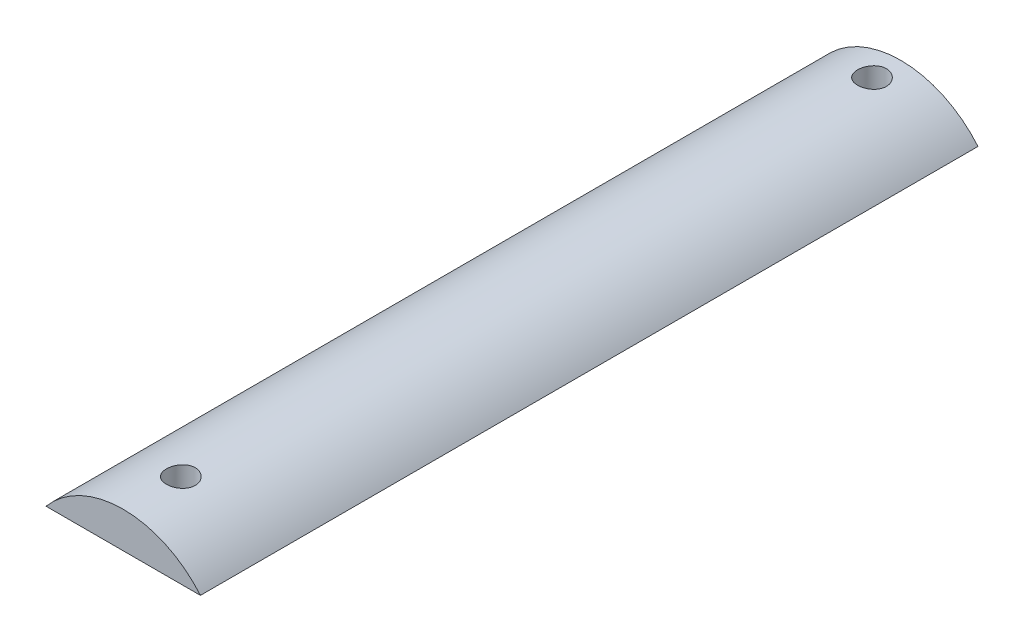
ISO-10303-21;
HEADER;
FILE_DESCRIPTION(('STEP AP214'),'2;1');
FILE_NAME('part.step','',(''),(''),'','','');
FILE_SCHEMA(('AUTOMOTIVE_DESIGN { 1 0 10303 214 1 1 1 1 }'));
ENDSEC;
DATA;
#1=APPLICATION_CONTEXT('core data for automotive mechanical design processes');
#2=APPLICATION_PROTOCOL_DEFINITION('international standard','automotive_design',2000,#1);
#3=PRODUCT_CONTEXT('',#1,'mechanical');
#4=PRODUCT('Part','Part','',(#3));
#5=PRODUCT_RELATED_PRODUCT_CATEGORY('part','',(#4));
#6=PRODUCT_DEFINITION_FORMATION('','',#4);
#7=PRODUCT_DEFINITION_CONTEXT('part definition',#1,'design');
#8=PRODUCT_DEFINITION('design','',#6,#7);
#9=PRODUCT_DEFINITION_SHAPE('','',#8);
#10=(LENGTH_UNIT() NAMED_UNIT(*) SI_UNIT(.MILLI.,.METRE.));
#11=(NAMED_UNIT(*) PLANE_ANGLE_UNIT() SI_UNIT($,.RADIAN.));
#12=(NAMED_UNIT(*) SI_UNIT($,.STERADIAN.) SOLID_ANGLE_UNIT());
#13=UNCERTAINTY_MEASURE_WITH_UNIT(LENGTH_MEASURE(1.E-05),#10,'distance_accuracy_value','');
#14=(GEOMETRIC_REPRESENTATION_CONTEXT(3) GLOBAL_UNCERTAINTY_ASSIGNED_CONTEXT((#13)) GLOBAL_UNIT_ASSIGNED_CONTEXT((#10,
#11,#12)) REPRESENTATION_CONTEXT('',''));
#15=CARTESIAN_POINT('',(0.,0.,0.));
#16=DIRECTION('',(0.,0.,1.));
#17=DIRECTION('',(1.,0.,0.));
#18=AXIS2_PLACEMENT_3D('',#15,#16,#17);
#19=CARTESIAN_POINT('',(0.,4.5,54.));
#20=DIRECTION('',(0.,1.,0.));
#21=DIRECTION('',(0.,0.,1.));
#22=AXIS2_PLACEMENT_3D('',#19,#20,#21);
#23=PLANE('',#22);
#24=DIRECTION('',(-0.5,0.,0.866025403784439));
#25=VECTOR('',#24,1.);
#26=CARTESIAN_POINT('',(2.30940107675834,4.5,50.));
#27=LINE('',#26,#25);
#28=CARTESIAN_POINT('',(2.30940107675834,4.5,50.));
#29=VERTEX_POINT('',#28);
#30=CARTESIAN_POINT('',(1.15470053837908,4.5,52.));
#31=VERTEX_POINT('',#30);
#32=EDGE_CURVE('E220',#29,#31,#27,.T.);
#33=ORIENTED_EDGE('',*,*,#32,.F.);
#34=DIRECTION('',(0.5,0.,0.866025403784439));
#35=VECTOR('',#34,1.);
#36=CARTESIAN_POINT('',(1.15470053837908,4.5,48.));
#37=LINE('',#36,#35);
#38=CARTESIAN_POINT('',(1.15470053837908,4.5,48.));
#39=VERTEX_POINT('',#38);
#40=EDGE_CURVE('E52',#39,#29,#37,.T.);
#41=ORIENTED_EDGE('',*,*,#40,.F.);
#42=DIRECTION('',(1.,0.,0.));
#43=VECTOR('',#42,1.);
#44=CARTESIAN_POINT('',(-1.15470053837942,4.5,48.));
#45=LINE('',#44,#43);
#46=CARTESIAN_POINT('',(-1.15470053837942,4.5,48.));
#47=VERTEX_POINT('',#46);
#48=EDGE_CURVE('E203',#47,#39,#45,.T.);
#49=ORIENTED_EDGE('',*,*,#48,.F.);
#50=DIRECTION('',(0.5,0.,-0.866025403784439));
#51=VECTOR('',#50,1.);
#52=CARTESIAN_POINT('',(-2.30940107675867,4.5,50.));
#53=LINE('',#52,#51);
#54=CARTESIAN_POINT('',(-2.30940107675867,4.5,50.));
#55=VERTEX_POINT('',#54);
#56=EDGE_CURVE('E229',#55,#47,#53,.T.);
#57=ORIENTED_EDGE('',*,*,#56,.F.);
#58=DIRECTION('',(-0.499999999999999,0.,-0.866025403784439));
#59=VECTOR('',#58,1.);
#60=CARTESIAN_POINT('',(-1.15470053837942,4.5,52.));
#61=LINE('',#60,#59);
#62=CARTESIAN_POINT('',(-1.15470053837942,4.5,52.));
#63=VERTEX_POINT('',#62);
#64=EDGE_CURVE('E226',#63,#55,#61,.T.);
#65=ORIENTED_EDGE('',*,*,#64,.F.);
#66=DIRECTION('',(-1.,0.,0.));
#67=VECTOR('',#66,1.);
#68=CARTESIAN_POINT('',(1.15470053837908,4.5,52.));
#69=LINE('',#68,#67);
#70=EDGE_CURVE('E223',#31,#63,#69,.T.);
#71=ORIENTED_EDGE('',*,*,#70,.F.);
#72=EDGE_LOOP('',(#33,#41,#49,#57,#65,#71));
#73=FACE_BOUND('',#72,.T.);
#74=DIRECTION('',(-0.5,0.,0.866025403784439));
#75=VECTOR('',#74,1.);
#76=CARTESIAN_POINT('',(2.3094010767585,4.5,2.));
#77=LINE('',#76,#75);
#78=CARTESIAN_POINT('',(2.3094010767585,4.5,2.));
#79=VERTEX_POINT('',#78);
#80=CARTESIAN_POINT('',(1.15470053837925,4.5,4.));
#81=VERTEX_POINT('',#80);
#82=EDGE_CURVE('E180',#79,#81,#77,.T.);
#83=ORIENTED_EDGE('',*,*,#82,.F.);
#84=DIRECTION('',(0.5,0.,0.866025403784439));
#85=VECTOR('',#84,1.);
#86=CARTESIAN_POINT('',(1.15470053837925,4.5,0.));
#87=LINE('',#86,#85);
#88=CARTESIAN_POINT('',(1.15470053837925,4.5,0.));
#89=VERTEX_POINT('',#88);
#90=EDGE_CURVE('E145',#89,#79,#87,.T.);
#91=ORIENTED_EDGE('',*,*,#90,.F.);
#92=DIRECTION('',(1.,0.,0.));
#93=VECTOR('',#92,1.);
#94=CARTESIAN_POINT('',(0.,4.5,0.));
#95=LINE('',#94,#93);
#96=CARTESIAN_POINT('',(5.36190264738181,4.5,0.));
#97=VERTEX_POINT('',#96);
#98=EDGE_CURVE('E190',#89,#97,#95,.T.);
#99=ORIENTED_EDGE('',*,*,#98,.T.);
#100=DIRECTION('',(0.,0.,-1.));
#101=VECTOR('',#100,1.);
#102=CARTESIAN_POINT('',(5.36190264738181,4.5,54.));
#103=LINE('',#102,#101);
#104=CARTESIAN_POINT('',(5.36190264738181,4.5,54.));
#105=VERTEX_POINT('',#104);
#106=EDGE_CURVE('E45',#105,#97,#103,.T.);
#107=ORIENTED_EDGE('',*,*,#106,.F.);
#108=DIRECTION('',(1.,0.,0.));
#109=VECTOR('',#108,1.);
#110=CARTESIAN_POINT('',(0.,4.5,54.));
#111=LINE('',#110,#109);
#112=CARTESIAN_POINT('',(-5.36190264738181,4.5,54.));
#113=VERTEX_POINT('',#112);
#114=EDGE_CURVE('E244',#113,#105,#111,.T.);
#115=ORIENTED_EDGE('',*,*,#114,.F.);
#116=DIRECTION('',(0.,0.,-1.));
#117=VECTOR('',#116,1.);
#118=CARTESIAN_POINT('',(-5.36190264738181,4.5,54.));
#119=LINE('',#118,#117);
#120=CARTESIAN_POINT('',(-5.36190264738181,4.5,0.));
#121=VERTEX_POINT('',#120);
#122=EDGE_CURVE('E250',#113,#121,#119,.T.);
#123=ORIENTED_EDGE('',*,*,#122,.T.);
#124=CARTESIAN_POINT('',(-1.15470053837925,4.5,0.));
#125=VERTEX_POINT('',#124);
#126=EDGE_CURVE('E251',#121,#125,#95,.T.);
#127=ORIENTED_EDGE('',*,*,#126,.T.);
#128=DIRECTION('',(0.5,0.,-0.866025403784439));
#129=VECTOR('',#128,1.);
#130=CARTESIAN_POINT('',(-2.3094010767585,4.5,2.));
#131=LINE('',#130,#129);
#132=CARTESIAN_POINT('',(-2.3094010767585,4.5,2.));
#133=VERTEX_POINT('',#132);
#134=EDGE_CURVE('E162',#133,#125,#131,.T.);
#135=ORIENTED_EDGE('',*,*,#134,.F.);
#136=DIRECTION('',(-0.5,0.,-0.866025403784439));
#137=VECTOR('',#136,1.);
#138=CARTESIAN_POINT('',(-1.15470053837925,4.5,4.));
#139=LINE('',#138,#137);
#140=CARTESIAN_POINT('',(-1.15470053837925,4.5,4.));
#141=VERTEX_POINT('',#140);
#142=EDGE_CURVE('E164',#141,#133,#139,.T.);
#143=ORIENTED_EDGE('',*,*,#142,.F.);
#144=DIRECTION('',(-1.,0.,0.));
#145=VECTOR('',#144,1.);
#146=CARTESIAN_POINT('',(1.15470053837925,4.5,4.));
#147=LINE('',#146,#145);
#148=EDGE_CURVE('E183',#81,#141,#147,.T.);
#149=ORIENTED_EDGE('',*,*,#148,.F.);
#150=EDGE_LOOP('',(#83,#91,#99,#107,#115,#123,#127,#135,#143,#149));
#151=FACE_BOUND('',#150,.T.);
#152=ADVANCED_FACE('F34',(#73,#151),#23,.F.);
#153=CARTESIAN_POINT('',(0.,0.,54.));
#154=DIRECTION('',(0.,0.,-1.));
#155=DIRECTION('',(-1.,0.,0.));
#156=AXIS2_PLACEMENT_3D('',#153,#154,#155);
#157=CYLINDRICAL_SURFACE('',#156,7.);
#158=CARTESIAN_POINT('',(0.,7.,1.));
#159=CARTESIAN_POINT('',(0.0558653647064106,6.99999913522882,1.00000232658881));
#160=CARTESIAN_POINT('',(0.111763905495517,6.99932420200296,1.0046972071594));
#161=CARTESIAN_POINT('',(0.222000660368081,6.99669670505877,1.02334913623399));
#162=CARTESIAN_POINT('',(0.276337265533478,6.99474286996306,1.03731540177038));
#163=CARTESIAN_POINT('',(0.381838676785442,6.98977730161823,1.07408606173423));
#164=CARTESIAN_POINT('',(0.43300576934977,6.98676634168295,1.09688399682651));
#165=CARTESIAN_POINT('',(0.530779650240317,6.98001989080586,1.15065554289536));
#166=CARTESIAN_POINT('',(0.57738711543865,6.97628450765023,1.18162793784958));
#167=CARTESIAN_POINT('',(0.665058650397312,6.96847539120891,1.25110417116727));
#168=CARTESIAN_POINT('',(0.70608559080065,6.96439965767478,1.28965464285791));
#169=CARTESIAN_POINT('',(0.781111291768627,6.95638499821218,1.37309241453966));
#170=CARTESIAN_POINT('',(0.815109662708696,6.95244607987804,1.41798006559652));
#171=CARTESIAN_POINT('',(0.875255876422228,6.94513156490684,1.51306511605375));
#172=CARTESIAN_POINT('',(0.901368125473884,6.94175855199628,1.56328524628515));
#173=CARTESIAN_POINT('',(0.944773451668098,6.93598482656287,1.66745453949105));
#174=CARTESIAN_POINT('',(0.962066964544983,6.93358406600217,1.72140351807332));
#175=CARTESIAN_POINT('',(0.987229320061167,6.93004619376593,1.83111000982802));
#176=CARTESIAN_POINT('',(0.995161488527954,6.92890059523603,1.88685271992782));
#177=CARTESIAN_POINT('',(1.00157210007568,6.92797693845422,1.9988889054348));
#178=CARTESIAN_POINT('',(1.00005103626979,6.92819880887042,2.05518235196072));
#179=CARTESIAN_POINT('',(0.987650180979409,6.9299772577103,2.16627654533307));
#180=CARTESIAN_POINT('',(0.976840681796494,6.9315238110212,2.22108532204585));
#181=CARTESIAN_POINT('',(0.946279723214286,6.93576171689508,2.32810308628426));
#182=CARTESIAN_POINT('',(0.926528032474813,6.9384530990754,2.38031200651116));
#183=CARTESIAN_POINT('',(0.878569521249536,6.94468857735278,2.48086327310843));
#184=CARTESIAN_POINT('',(0.85033269311634,6.94823569081255,2.5291911123858));
#185=CARTESIAN_POINT('',(0.786226845720379,6.95578073890064,2.6204492121893));
#186=CARTESIAN_POINT('',(0.750357371512553,6.95977870039515,2.66337915072994));
#187=CARTESIAN_POINT('',(0.671617458714389,6.9678193568045,2.74303040311463));
#188=CARTESIAN_POINT('',(0.628686537577609,6.97186212884533,2.77969194505996));
#189=CARTESIAN_POINT('',(0.537249159400889,6.97950317895594,2.84529850122326));
#190=CARTESIAN_POINT('',(0.48874268187249,6.98310145539225,2.87424348708397));
#191=CARTESIAN_POINT('',(0.387481039813844,6.98945135313469,2.92359743749929));
#192=CARTESIAN_POINT('',(0.334723727733655,6.99220254306019,2.94400205474713));
#193=CARTESIAN_POINT('',(0.226483349377097,6.99654459946019,2.97564546931975));
#194=CARTESIAN_POINT('',(0.171000450315641,6.99813553702157,2.98688482819091));
#195=CARTESIAN_POINT('',(0.0594000111949727,6.99996847286368,2.99979981341021));
#196=CARTESIAN_POINT('',(0.00329216977119557,7.00022206812239,3.00155766323425));
#197=CARTESIAN_POINT('',(-0.108417425156648,6.9993832363385,2.99567759598996));
#198=CARTESIAN_POINT('',(-0.164019192788029,6.99829084698658,2.98803994201746));
#199=CARTESIAN_POINT('',(-0.272891208992243,6.99488996866151,2.96365402920264));
#200=CARTESIAN_POINT('',(-0.326170552460061,6.99258679365044,2.94694557041022));
#201=CARTESIAN_POINT('',(-0.429171472012341,6.98702187136217,2.90493413035229));
#202=CARTESIAN_POINT('',(-0.47889289454054,6.98376008274315,2.87963077841043));
#203=CARTESIAN_POINT('',(-0.573729847898929,6.97661188585467,2.82095309150627));
#204=CARTESIAN_POINT('',(-0.618812606348985,6.97272147424604,2.78752628514727));
#205=CARTESIAN_POINT('',(-0.70275764740243,6.96476223215387,2.71362396197387));
#206=CARTESIAN_POINT('',(-0.741619603539291,6.96069339232073,2.67314807545766));
#207=CARTESIAN_POINT('',(-0.812316823103834,6.95279940084852,2.58593164951777));
#208=CARTESIAN_POINT('',(-0.844097150424188,6.94897630774254,2.53914636484974));
#209=CARTESIAN_POINT('',(-0.899347843769572,6.94204235740405,2.440853406698));
#210=CARTESIAN_POINT('',(-0.922818417525415,6.9389314823679,2.38934585130419));
#211=CARTESIAN_POINT('',(-0.960697053792666,6.93378885130881,2.28323834774685));
#212=CARTESIAN_POINT('',(-0.975134650659851,6.93175358189617,2.22864912057935));
#213=CARTESIAN_POINT('',(-0.994631866000765,6.92898304632217,2.1177897194722));
#214=CARTESIAN_POINT('',(-0.999692066965096,6.92824769941436,2.06151965016116));
#215=CARTESIAN_POINT('',(-1.00027795187105,6.92816308872538,1.94944308673935));
#216=CARTESIAN_POINT('',(-0.99588998683903,6.92880127161589,1.89363703417234));
#217=CARTESIAN_POINT('',(-0.977888479253999,6.9313646210599,1.78356493797077));
#218=CARTESIAN_POINT('',(-0.964274946206753,6.93328978628734,1.72929889274949));
#219=CARTESIAN_POINT('',(-0.92823822782898,6.93820594738757,1.62386736744441));
#220=CARTESIAN_POINT('',(-0.905820514813006,6.94119628108845,1.57269998411848));
#221=CARTESIAN_POINT('',(-0.852820321015437,6.94790672863692,1.4748387775233));
#222=CARTESIAN_POINT('',(-0.822237615959197,6.95162686252979,1.4281450771843));
#223=CARTESIAN_POINT('',(-0.753459737315476,6.95941831326445,1.34011709073554));
#224=CARTESIAN_POINT('',(-0.715200464701825,6.96349241131826,1.29883312739888));
#225=CARTESIAN_POINT('',(-0.632290756660576,6.97150911027032,1.22324014628388));
#226=CARTESIAN_POINT('',(-0.587638832167471,6.97545168026666,1.18893275810575));
#227=CARTESIAN_POINT('',(-0.492951712266923,6.98278331246282,1.12811621398193));
#228=CARTESIAN_POINT('',(-0.442890858727148,6.98616952559765,1.10164667292105));
#229=CARTESIAN_POINT('',(-0.339010644185018,6.99197878037442,1.05753012799695));
#230=CARTESIAN_POINT('',(-0.28519530259949,6.99440283401541,1.03987384928381));
#231=CARTESIAN_POINT('',(-0.192605681998779,6.99745181502523,1.01795820654369));
#232=CARTESIAN_POINT('',(-0.154406949589287,6.99840255428231,1.01123398153088));
#233=CARTESIAN_POINT('',(-0.0774774606828314,6.99967694328895,1.0022540954559));
#234=CARTESIAN_POINT('',(-0.0387467099115308,7.00000059978196,0.999998386340764));
#235=CARTESIAN_POINT('',(0.,7.,1.));
#236=B_SPLINE_CURVE_WITH_KNOTS('',3,(#158,#159,#160,#161,#162,#163,#164,#165,#166,#167,#168,
#169,#170,#171,#172,#173,#174,#175,#176,#177,#178,#179,#180,#181,#182,#183,#184,#185,#186,#187,
#188,#189,#190,#191,#192,#193,#194,#195,#196,#197,#198,#199,#200,#201,#202,#203,#204,#205,#206,
#207,#208,#209,#210,#211,#212,#213,#214,#215,#216,#217,#218,#219,#220,#221,#222,#223,#224,#225,
#226,#227,#228,#229,#230,#231,#232,#233,#234,#235),.UNSPECIFIED.,.T.,.F.,(4,2,2,2,2,2,2,2,2,2,2,
2,2,2,2,2,2,2,2,2,2,2,2,2,2,2,2,2,2,2,2,2,2,2,2,2,2,2,4),(0.,0.167454526676438,
0.335075775995835,0.502574660696851,0.67004864250517,0.838587434288067,1.00713556641494,
1.17643344042558,1.34572294860658,1.51386059320977,1.68198946724779,1.84885708289861,
2.01572901576745,2.18319817810949,2.35067732527464,2.51967378353348,2.6886708628223,
2.85775386243831,3.02682650172624,3.19443056043042,3.3620299259403,3.5288997886847,
3.69577684902495,3.86376187993315,4.03175572377582,4.20101062362346,4.37026129206513,
4.53895564370425,4.70763951629676,4.87478825923561,5.0419368299494,5.20898167202542,
5.37603110293353,5.54453823754737,5.71308468724557,5.88246902499656,6.05167472923067,
6.1678179205788,6.28395986295406),.UNSPECIFIED.);
#237=CARTESIAN_POINT('',(0.,7.,1.));
#238=VERTEX_POINT('',#237);
#239=EDGE_CURVE('E167',#238,#238,#236,.T.);
#240=ORIENTED_EDGE('',*,*,#239,.T.);
#241=EDGE_LOOP('',(#240));
#242=FACE_BOUND('',#241,.T.);
#243=CARTESIAN_POINT('',(-1.6759110426447E-13,7.,49.));
#244=CARTESIAN_POINT('',(0.0558653647062429,6.99999913522882,49.0000023265888));
#245=CARTESIAN_POINT('',(0.111763905495349,6.99932420200296,49.0046972071594));
#246=CARTESIAN_POINT('',(0.222000660367912,6.99669670505878,49.023349136234));
#247=CARTESIAN_POINT('',(0.276337265533309,6.99474286996307,49.0373154017704));
#248=CARTESIAN_POINT('',(0.381838676785273,6.98977730161824,49.0740860617342));
#249=CARTESIAN_POINT('',(0.433005769349602,6.98676634168296,49.0968839968265));
#250=CARTESIAN_POINT('',(0.53077965024015,6.98001989080588,49.1506555428954));
#251=CARTESIAN_POINT('',(0.577387115438482,6.97628450765025,49.1816279378496));
#252=CARTESIAN_POINT('',(0.665058650397143,6.96847539120893,49.2511041711673));
#253=CARTESIAN_POINT('',(0.70608559080048,6.96439965767479,49.2896546428579));
#254=CARTESIAN_POINT('',(0.781111291768457,6.95638499821219,49.3730924145397));
#255=CARTESIAN_POINT('',(0.815109662708528,6.95244607987806,49.4179800655965));
#256=CARTESIAN_POINT('',(0.875255876422061,6.94513156490686,49.5130651160538));
#257=CARTESIAN_POINT('',(0.901368125473716,6.94175855199631,49.5632852462852));
#258=CARTESIAN_POINT('',(0.944773451667931,6.93598482656289,49.6674545394911));
#259=CARTESIAN_POINT('',(0.962066964544816,6.93358406600219,49.7214035180733));
#260=CARTESIAN_POINT('',(0.987229320061001,6.93004619376596,49.831110009828));
#261=CARTESIAN_POINT('',(0.995161488527787,6.92890059523605,49.8868527199278));
#262=CARTESIAN_POINT('',(1.00157210007552,6.92797693845424,49.9988889054348));
#263=CARTESIAN_POINT('',(1.00005103626962,6.92819880887044,50.0551823519607));
#264=CARTESIAN_POINT('',(0.987650180979242,6.92997725771032,50.1662765453331));
#265=CARTESIAN_POINT('',(0.976840681796326,6.93152381102122,50.2210853220459));
#266=CARTESIAN_POINT('',(0.946279723214119,6.9357617168951,50.3281030862843));
#267=CARTESIAN_POINT('',(0.926528032474647,6.93845309907542,50.3803120065112));
#268=CARTESIAN_POINT('',(0.87856952124937,6.94468857735281,50.4808632731084));
#269=CARTESIAN_POINT('',(0.850332693116172,6.94823569081257,50.5291911123858));
#270=CARTESIAN_POINT('',(0.786226845720212,6.95578073890066,50.6204492121893));
#271=CARTESIAN_POINT('',(0.750357371512386,6.95977870039517,50.6633791507299));
#272=CARTESIAN_POINT('',(0.671617458714221,6.96781935680452,50.7430304031146));
#273=CARTESIAN_POINT('',(0.62868653757744,6.97186212884534,50.77969194506));
#274=CARTESIAN_POINT('',(0.537249159400719,6.97950317895596,50.8452985012233));
#275=CARTESIAN_POINT('',(0.48874268187232,6.98310145539226,50.874243487084));
#276=CARTESIAN_POINT('',(0.387481039813676,6.9894513531347,50.9235974374993));
#277=CARTESIAN_POINT('',(0.334723727733488,6.9922025430602,50.9440020547471));
#278=CARTESIAN_POINT('',(0.226483349376931,6.99654459946019,50.9756454693198));
#279=CARTESIAN_POINT('',(0.171000450315474,6.99813553702158,50.9868848281909));
#280=CARTESIAN_POINT('',(0.0594000111948055,6.99996847286368,50.9997998134102));
#281=CARTESIAN_POINT('',(0.00329216977102907,7.00022206812239,51.0015576632343));
#282=CARTESIAN_POINT('',(-0.108417425156814,6.9993832363385,50.99567759599));
#283=CARTESIAN_POINT('',(-0.164019192788196,6.99829084698658,50.9880399420175));
#284=CARTESIAN_POINT('',(-0.27289120899241,6.9948899686615,50.9636540292027));
#285=CARTESIAN_POINT('',(-0.326170552460228,6.99258679365044,50.9469455704102));
#286=CARTESIAN_POINT('',(-0.429171472012507,6.98702187136216,50.9049341303523));
#287=CARTESIAN_POINT('',(-0.478892894540707,6.98376008274314,50.8796307784104));
#288=CARTESIAN_POINT('',(-0.573729847899095,6.97661188585466,50.8209530915063));
#289=CARTESIAN_POINT('',(-0.61881260634915,6.97272147424602,50.7875262851473));
#290=CARTESIAN_POINT('',(-0.702757647402596,6.96476223215386,50.7136239619739));
#291=CARTESIAN_POINT('',(-0.741619603539457,6.96069339232071,50.6731480754577));
#292=CARTESIAN_POINT('',(-0.812316823104001,6.9527994008485,50.5859316495178));
#293=CARTESIAN_POINT('',(-0.844097150424355,6.94897630774252,50.5391463648497));
#294=CARTESIAN_POINT('',(-0.89934784376974,6.94204235740403,50.440853406698));
#295=CARTESIAN_POINT('',(-0.922818417525583,6.93893148236787,50.3893458513042));
#296=CARTESIAN_POINT('',(-0.960697053792834,6.93378885130878,50.2832383477469));
#297=CARTESIAN_POINT('',(-0.975134650660019,6.93175358189615,50.2286491205794));
#298=CARTESIAN_POINT('',(-0.994631866000932,6.92898304632215,50.1177897194722));
#299=CARTESIAN_POINT('',(-0.999692066965264,6.92824769941433,50.0615196501612));
#300=CARTESIAN_POINT('',(-1.00027795187122,6.92816308872536,49.9494430867394));
#301=CARTESIAN_POINT('',(-0.995889986839198,6.92880127161586,49.8936370341723));
#302=CARTESIAN_POINT('',(-0.977888479254165,6.93136462105988,49.7835649379708));
#303=CARTESIAN_POINT('',(-0.96427494620692,6.93328978628732,49.7292988927495));
#304=CARTESIAN_POINT('',(-0.928238227829149,6.93820594738754,49.6238673674444));
#305=CARTESIAN_POINT('',(-0.905820514813177,6.94119628108843,49.5726999841185));
#306=CARTESIAN_POINT('',(-0.852820321015609,6.9479067286369,49.4748387775233));
#307=CARTESIAN_POINT('',(-0.822237615959368,6.95162686252977,49.4281450771843));
#308=CARTESIAN_POINT('',(-0.753459737315644,6.95941831326443,49.3401170907355));
#309=CARTESIAN_POINT('',(-0.715200464701993,6.96349241131824,49.2988331273989));
#310=CARTESIAN_POINT('',(-0.632290756660744,6.97150911027031,49.2232401462839));
#311=CARTESIAN_POINT('',(-0.58763883216764,6.97545168026665,49.1889327581058));
#312=CARTESIAN_POINT('',(-0.492951712267093,6.9827833124628,49.1281162139819));
#313=CARTESIAN_POINT('',(-0.442890858727319,6.98616952559764,49.1016466729211));
#314=CARTESIAN_POINT('',(-0.339010644185189,6.99197878037441,49.057530127997));
#315=CARTESIAN_POINT('',(-0.28519530259966,6.9944028340154,49.0398738492838));
#316=CARTESIAN_POINT('',(-0.192605681998948,6.99745181502523,49.0179582065437));
#317=CARTESIAN_POINT('',(-0.154406949589455,6.99840255428231,49.0112339815309));
#318=CARTESIAN_POINT('',(-0.0774774606829997,6.99967694328895,49.0022540954559));
#319=CARTESIAN_POINT('',(-0.0387467099116987,7.00000059978196,48.9999983863408));
#320=CARTESIAN_POINT('',(-1.6759110426447E-13,7.,49.));
#321=B_SPLINE_CURVE_WITH_KNOTS('',3,(#243,#244,#245,#246,#247,#248,#249,#250,#251,#252,#253,
#254,#255,#256,#257,#258,#259,#260,#261,#262,#263,#264,#265,#266,#267,#268,#269,#270,#271,#272,
#273,#274,#275,#276,#277,#278,#279,#280,#281,#282,#283,#284,#285,#286,#287,#288,#289,#290,#291,
#292,#293,#294,#295,#296,#297,#298,#299,#300,#301,#302,#303,#304,#305,#306,#307,#308,#309,#310,
#311,#312,#313,#314,#315,#316,#317,#318,#319,#320),.UNSPECIFIED.,.T.,.F.,(4,2,2,2,2,2,2,2,2,2,2,
2,2,2,2,2,2,2,2,2,2,2,2,2,2,2,2,2,2,2,2,2,2,2,2,2,2,2,4),(0.,0.167454526676438,
0.335075775995835,0.502574660696851,0.670048642505167,0.838587434288064,1.00713556641494,
1.17643344042558,1.34572294860658,1.51386059320977,1.68198946724779,1.84885708289861,
2.01572901576745,2.18319817810949,2.35067732527464,2.51967378353348,2.6886708628223,
2.8577538624383,3.02682650172624,3.19443056043042,3.36202992594029,3.5288997886847,
3.69577684902495,3.86376187993314,4.03175572377582,4.20101062362345,4.37026129206513,
4.53895564370424,4.70763951629676,4.87478825923561,5.0419368299494,5.20898167202541,
5.37603110293353,5.54453823754737,5.71308468724556,5.88246902499656,6.05167472923067,
6.1678179205788,6.28395986295406),.UNSPECIFIED.);
#322=CARTESIAN_POINT('',(-1.6759110426447E-13,7.,49.));
#323=VERTEX_POINT('',#322);
#324=EDGE_CURVE('E11',#323,#323,#321,.T.);
#325=ORIENTED_EDGE('',*,*,#324,.T.);
#326=EDGE_LOOP('',(#325));
#327=FACE_BOUND('',#326,.T.);
#328=CARTESIAN_POINT('',(0.,0.,0.));
#329=DIRECTION('',(0.,0.,1.));
#330=DIRECTION('',(1.,0.,0.));
#331=AXIS2_PLACEMENT_3D('',#328,#329,#330);
#332=CIRCLE('',#331,7.);
#333=EDGE_CURVE('E248',#97,#121,#332,.T.);
#334=ORIENTED_EDGE('',*,*,#333,.T.);
#335=ORIENTED_EDGE('',*,*,#122,.F.);
#336=CARTESIAN_POINT('',(0.,0.,54.));
#337=DIRECTION('',(0.,0.,1.));
#338=DIRECTION('',(1.,0.,0.));
#339=AXIS2_PLACEMENT_3D('',#336,#337,#338);
#340=CIRCLE('',#339,7.);
#341=EDGE_CURVE('E247',#105,#113,#340,.T.);
#342=ORIENTED_EDGE('',*,*,#341,.F.);
#343=ORIENTED_EDGE('',*,*,#106,.T.);
#344=EDGE_LOOP('',(#334,#335,#342,#343));
#345=FACE_BOUND('',#344,.T.);
#346=ADVANCED_FACE('F259',(#242,#327,#345),#157,.T.);
#347=CARTESIAN_POINT('',(0.,0.,54.));
#348=DIRECTION('',(0.,0.,1.));
#349=DIRECTION('',(1.,0.,0.));
#350=AXIS2_PLACEMENT_3D('',#347,#348,#349);
#351=PLANE('',#350);
#352=ORIENTED_EDGE('',*,*,#114,.T.);
#353=ORIENTED_EDGE('',*,*,#341,.T.);
#354=EDGE_LOOP('',(#352,#353));
#355=FACE_BOUND('',#354,.T.);
#356=ADVANCED_FACE('F291',(#355),#351,.T.);
#357=CARTESIAN_POINT('',(0.,0.,0.));
#358=DIRECTION('',(0.,0.,1.));
#359=DIRECTION('',(1.,0.,0.));
#360=AXIS2_PLACEMENT_3D('',#357,#358,#359);
#361=PLANE('',#360);
#362=ORIENTED_EDGE('',*,*,#98,.F.);
#363=DIRECTION('',(0.,-1.,0.));
#364=VECTOR('',#363,1.);
#365=CARTESIAN_POINT('',(1.15470053837925,5.5,0.));
#366=LINE('',#365,#364);
#367=CARTESIAN_POINT('',(1.15470053837925,5.5,0.));
#368=VERTEX_POINT('',#367);
#369=EDGE_CURVE('E188',#368,#89,#366,.T.);
#370=ORIENTED_EDGE('',*,*,#369,.F.);
#371=DIRECTION('',(1.,0.,0.));
#372=VECTOR('',#371,1.);
#373=CARTESIAN_POINT('',(-1.15470053837925,5.5,0.));
#374=LINE('',#373,#372);
#375=CARTESIAN_POINT('',(-1.15470053837925,5.5,0.));
#376=VERTEX_POINT('',#375);
#377=EDGE_CURVE('E150',#376,#368,#374,.T.);
#378=ORIENTED_EDGE('',*,*,#377,.F.);
#379=DIRECTION('',(0.,-1.,0.));
#380=VECTOR('',#379,1.);
#381=CARTESIAN_POINT('',(-1.15470053837925,5.5,0.));
#382=LINE('',#381,#380);
#383=EDGE_CURVE('E191',#376,#125,#382,.T.);
#384=ORIENTED_EDGE('',*,*,#383,.T.);
#385=ORIENTED_EDGE('',*,*,#126,.F.);
#386=ORIENTED_EDGE('',*,*,#333,.F.);
#387=EDGE_LOOP('',(#362,#370,#378,#384,#385,#386));
#388=FACE_BOUND('',#387,.T.);
#389=ADVANCED_FACE('F267',(#388),#361,.F.);
#390=CARTESIAN_POINT('',(1.15470053837925,5.5,0.));
#391=DIRECTION('',(0.866025403784439,0.,-0.5));
#392=DIRECTION('',(-0.5,0.,-0.866025403784439));
#393=AXIS2_PLACEMENT_3D('',#390,#391,#392);
#394=PLANE('',#393);
#395=ORIENTED_EDGE('',*,*,#90,.T.);
#396=DIRECTION('',(0.,-1.,0.));
#397=VECTOR('',#396,1.);
#398=CARTESIAN_POINT('',(2.3094010767585,5.5,2.));
#399=LINE('',#398,#397);
#400=CARTESIAN_POINT('',(2.3094010767585,5.5,2.));
#401=VERTEX_POINT('',#400);
#402=EDGE_CURVE('E139',#401,#79,#399,.T.);
#403=ORIENTED_EDGE('',*,*,#402,.F.);
#404=DIRECTION('',(0.5,0.,0.866025403784439));
#405=VECTOR('',#404,1.);
#406=CARTESIAN_POINT('',(1.15470053837925,5.5,0.));
#407=LINE('',#406,#405);
#408=EDGE_CURVE('E143',#368,#401,#407,.T.);
#409=ORIENTED_EDGE('',*,*,#408,.F.);
#410=ORIENTED_EDGE('',*,*,#369,.T.);
#411=EDGE_LOOP('',(#395,#403,#409,#410));
#412=FACE_BOUND('',#411,.T.);
#413=ADVANCED_FACE('F141',(#412),#394,.F.);
#414=CARTESIAN_POINT('',(-2.3094010767585,5.5,2.));
#415=DIRECTION('',(-0.866025403784439,0.,-0.5));
#416=DIRECTION('',(-0.5,0.,0.866025403784439));
#417=AXIS2_PLACEMENT_3D('',#414,#415,#416);
#418=PLANE('',#417);
#419=ORIENTED_EDGE('',*,*,#134,.T.);
#420=ORIENTED_EDGE('',*,*,#383,.F.);
#421=DIRECTION('',(0.5,0.,-0.866025403784439));
#422=VECTOR('',#421,1.);
#423=CARTESIAN_POINT('',(-2.3094010767585,5.5,2.));
#424=LINE('',#423,#422);
#425=CARTESIAN_POINT('',(-2.3094010767585,5.5,2.));
#426=VERTEX_POINT('',#425);
#427=EDGE_CURVE('E60',#426,#376,#424,.T.);
#428=ORIENTED_EDGE('',*,*,#427,.F.);
#429=DIRECTION('',(0.,-1.,0.));
#430=VECTOR('',#429,1.);
#431=CARTESIAN_POINT('',(-2.3094010767585,5.5,2.));
#432=LINE('',#431,#430);
#433=EDGE_CURVE('E194',#426,#133,#432,.T.);
#434=ORIENTED_EDGE('',*,*,#433,.T.);
#435=EDGE_LOOP('',(#419,#420,#428,#434));
#436=FACE_BOUND('',#435,.T.);
#437=ADVANCED_FACE('F272',(#436),#418,.F.);
#438=CARTESIAN_POINT('',(-1.15470053837925,5.5,4.));
#439=DIRECTION('',(-0.866025403784439,0.,0.5));
#440=DIRECTION('',(0.5,0.,0.866025403784439));
#441=AXIS2_PLACEMENT_3D('',#438,#439,#440);
#442=PLANE('',#441);
#443=ORIENTED_EDGE('',*,*,#142,.T.);
#444=ORIENTED_EDGE('',*,*,#433,.F.);
#445=DIRECTION('',(-0.5,0.,-0.866025403784439));
#446=VECTOR('',#445,1.);
#447=CARTESIAN_POINT('',(-1.15470053837925,5.5,4.));
#448=LINE('',#447,#446);
#449=CARTESIAN_POINT('',(-1.15470053837925,5.5,4.));
#450=VERTEX_POINT('',#449);
#451=EDGE_CURVE('E175',#450,#426,#448,.T.);
#452=ORIENTED_EDGE('',*,*,#451,.F.);
#453=DIRECTION('',(0.,-1.,0.));
#454=VECTOR('',#453,1.);
#455=CARTESIAN_POINT('',(-1.15470053837925,5.5,4.));
#456=LINE('',#455,#454);
#457=EDGE_CURVE('E196',#450,#141,#456,.T.);
#458=ORIENTED_EDGE('',*,*,#457,.T.);
#459=EDGE_LOOP('',(#443,#444,#452,#458));
#460=FACE_BOUND('',#459,.T.);
#461=ADVANCED_FACE('F275',(#460),#442,.F.);
#462=CARTESIAN_POINT('',(1.15470053837925,5.5,4.));
#463=DIRECTION('',(0.,0.,1.));
#464=DIRECTION('',(1.,0.,0.));
#465=AXIS2_PLACEMENT_3D('',#462,#463,#464);
#466=PLANE('',#465);
#467=ORIENTED_EDGE('',*,*,#148,.T.);
#468=ORIENTED_EDGE('',*,*,#457,.F.);
#469=DIRECTION('',(-1.,0.,0.));
#470=VECTOR('',#469,1.);
#471=CARTESIAN_POINT('',(1.15470053837925,5.5,4.));
#472=LINE('',#471,#470);
#473=CARTESIAN_POINT('',(1.15470053837925,5.5,4.));
#474=VERTEX_POINT('',#473);
#475=EDGE_CURVE('E157',#474,#450,#472,.T.);
#476=ORIENTED_EDGE('',*,*,#475,.F.);
#477=DIRECTION('',(0.,-1.,0.));
#478=VECTOR('',#477,1.);
#479=CARTESIAN_POINT('',(1.15470053837925,5.5,4.));
#480=LINE('',#479,#478);
#481=EDGE_CURVE('E149',#474,#81,#480,.T.);
#482=ORIENTED_EDGE('',*,*,#481,.T.);
#483=EDGE_LOOP('',(#467,#468,#476,#482));
#484=FACE_BOUND('',#483,.T.);
#485=ADVANCED_FACE('F277',(#484),#466,.F.);
#486=CARTESIAN_POINT('',(2.3094010767585,5.5,2.));
#487=DIRECTION('',(0.866025403784439,0.,0.5));
#488=DIRECTION('',(0.5,0.,-0.866025403784439));
#489=AXIS2_PLACEMENT_3D('',#486,#487,#488);
#490=PLANE('',#489);
#491=ORIENTED_EDGE('',*,*,#82,.T.);
#492=ORIENTED_EDGE('',*,*,#481,.F.);
#493=DIRECTION('',(-0.5,0.,0.866025403784439));
#494=VECTOR('',#493,1.);
#495=CARTESIAN_POINT('',(2.3094010767585,5.5,2.));
#496=LINE('',#495,#494);
#497=EDGE_CURVE('E153',#401,#474,#496,.T.);
#498=ORIENTED_EDGE('',*,*,#497,.F.);
#499=ORIENTED_EDGE('',*,*,#402,.T.);
#500=EDGE_LOOP('',(#491,#492,#498,#499));
#501=FACE_BOUND('',#500,.T.);
#502=ADVANCED_FACE('F154',(#501),#490,.F.);
#503=CARTESIAN_POINT('',(0.,5.5,0.));
#504=DIRECTION('',(0.,-1.,0.));
#505=DIRECTION('',(0.,0.,-1.));
#506=AXIS2_PLACEMENT_3D('',#503,#504,#505);
#507=PLANE('',#506);
#508=CARTESIAN_POINT('',(0.,5.5,2.));
#509=DIRECTION('',(0.,-1.,0.));
#510=DIRECTION('',(0.,0.,-1.));
#511=AXIS2_PLACEMENT_3D('',#508,#509,#510);
#512=CIRCLE('',#511,1.);
#513=CARTESIAN_POINT('',(0.,5.5,1.));
#514=VERTEX_POINT('',#513);
#515=EDGE_CURVE('E422',#514,#514,#512,.T.);
#516=ORIENTED_EDGE('',*,*,#515,.F.);
#517=EDGE_LOOP('',(#516));
#518=FACE_BOUND('',#517,.T.);
#519=ORIENTED_EDGE('',*,*,#408,.T.);
#520=ORIENTED_EDGE('',*,*,#497,.T.);
#521=ORIENTED_EDGE('',*,*,#475,.T.);
#522=ORIENTED_EDGE('',*,*,#451,.T.);
#523=ORIENTED_EDGE('',*,*,#427,.T.);
#524=ORIENTED_EDGE('',*,*,#377,.T.);
#525=EDGE_LOOP('',(#519,#520,#521,#522,#523,#524));
#526=FACE_BOUND('',#525,.T.);
#527=ADVANCED_FACE('F159',(#518,#526),#507,.T.);
#528=CARTESIAN_POINT('',(1.15470053837908,5.5,48.));
#529=DIRECTION('',(0.866025403784439,0.,-0.5));
#530=DIRECTION('',(-0.5,0.,-0.866025403784439));
#531=AXIS2_PLACEMENT_3D('',#528,#529,#530);
#532=PLANE('',#531);
#533=ORIENTED_EDGE('',*,*,#40,.T.);
#534=DIRECTION('',(0.,-1.,0.));
#535=VECTOR('',#534,1.);
#536=CARTESIAN_POINT('',(2.30940107675834,5.5,50.));
#537=LINE('',#536,#535);
#538=CARTESIAN_POINT('',(2.30940107675834,5.5,50.));
#539=VERTEX_POINT('',#538);
#540=EDGE_CURVE('E218',#539,#29,#537,.T.);
#541=ORIENTED_EDGE('',*,*,#540,.F.);
#542=DIRECTION('',(0.5,0.,0.866025403784439));
#543=VECTOR('',#542,1.);
#544=CARTESIAN_POINT('',(1.15470053837908,5.5,48.));
#545=LINE('',#544,#543);
#546=CARTESIAN_POINT('',(1.15470053837908,5.5,48.));
#547=VERTEX_POINT('',#546);
#548=EDGE_CURVE('E199',#547,#539,#545,.T.);
#549=ORIENTED_EDGE('',*,*,#548,.F.);
#550=DIRECTION('',(0.,-1.,0.));
#551=VECTOR('',#550,1.);
#552=CARTESIAN_POINT('',(1.15470053837908,5.5,48.));
#553=LINE('',#552,#551);
#554=EDGE_CURVE('E181',#547,#39,#553,.T.);
#555=ORIENTED_EDGE('',*,*,#554,.T.);
#556=EDGE_LOOP('',(#533,#541,#549,#555));
#557=FACE_BOUND('',#556,.T.);
#558=ADVANCED_FACE('F302',(#557),#532,.F.);
#559=CARTESIAN_POINT('',(-1.15470053837942,5.5,48.));
#560=DIRECTION('',(0.,0.,-1.));
#561=DIRECTION('',(-1.,0.,0.));
#562=AXIS2_PLACEMENT_3D('',#559,#560,#561);
#563=PLANE('',#562);
#564=ORIENTED_EDGE('',*,*,#48,.T.);
#565=ORIENTED_EDGE('',*,*,#554,.F.);
#566=DIRECTION('',(1.,0.,0.));
#567=VECTOR('',#566,1.);
#568=CARTESIAN_POINT('',(-1.15470053837942,5.5,48.));
#569=LINE('',#568,#567);
#570=CARTESIAN_POINT('',(-1.15470053837942,5.5,48.));
#571=VERTEX_POINT('',#570);
#572=EDGE_CURVE('E215',#571,#547,#569,.T.);
#573=ORIENTED_EDGE('',*,*,#572,.F.);
#574=DIRECTION('',(0.,-1.,0.));
#575=VECTOR('',#574,1.);
#576=CARTESIAN_POINT('',(-1.15470053837942,5.5,48.));
#577=LINE('',#576,#575);
#578=EDGE_CURVE('E235',#571,#47,#577,.T.);
#579=ORIENTED_EDGE('',*,*,#578,.T.);
#580=EDGE_LOOP('',(#564,#565,#573,#579));
#581=FACE_BOUND('',#580,.T.);
#582=ADVANCED_FACE('F308',(#581),#563,.F.);
#583=CARTESIAN_POINT('',(-2.30940107675867,5.5,50.));
#584=DIRECTION('',(-0.866025403784439,0.,-0.5));
#585=DIRECTION('',(-0.5,0.,0.866025403784439));
#586=AXIS2_PLACEMENT_3D('',#583,#584,#585);
#587=PLANE('',#586);
#588=ORIENTED_EDGE('',*,*,#56,.T.);
#589=ORIENTED_EDGE('',*,*,#578,.F.);
#590=DIRECTION('',(0.5,0.,-0.866025403784439));
#591=VECTOR('',#590,1.);
#592=CARTESIAN_POINT('',(-2.30940107675867,5.5,50.));
#593=LINE('',#592,#591);
#594=CARTESIAN_POINT('',(-2.30940107675867,5.5,50.));
#595=VERTEX_POINT('',#594);
#596=EDGE_CURVE('E212',#595,#571,#593,.T.);
#597=ORIENTED_EDGE('',*,*,#596,.F.);
#598=DIRECTION('',(0.,-1.,0.));
#599=VECTOR('',#598,1.);
#600=CARTESIAN_POINT('',(-2.30940107675867,5.5,50.));
#601=LINE('',#600,#599);
#602=EDGE_CURVE('E237',#595,#55,#601,.T.);
#603=ORIENTED_EDGE('',*,*,#602,.T.);
#604=EDGE_LOOP('',(#588,#589,#597,#603));
#605=FACE_BOUND('',#604,.T.);
#606=ADVANCED_FACE('F311',(#605),#587,.F.);
#607=CARTESIAN_POINT('',(-1.15470053837942,5.5,52.));
#608=DIRECTION('',(-0.866025403784439,0.,0.499999999999999));
#609=DIRECTION('',(0.499999999999999,0.,0.866025403784439));
#610=AXIS2_PLACEMENT_3D('',#607,#608,#609);
#611=PLANE('',#610);
#612=ORIENTED_EDGE('',*,*,#64,.T.);
#613=ORIENTED_EDGE('',*,*,#602,.F.);
#614=DIRECTION('',(-0.499999999999999,0.,-0.866025403784439));
#615=VECTOR('',#614,1.);
#616=CARTESIAN_POINT('',(-1.15470053837942,5.5,52.));
#617=LINE('',#616,#615);
#618=CARTESIAN_POINT('',(-1.15470053837942,5.5,52.));
#619=VERTEX_POINT('',#618);
#620=EDGE_CURVE('E209',#619,#595,#617,.T.);
#621=ORIENTED_EDGE('',*,*,#620,.F.);
#622=DIRECTION('',(0.,-1.,0.));
#623=VECTOR('',#622,1.);
#624=CARTESIAN_POINT('',(-1.15470053837942,5.5,52.));
#625=LINE('',#624,#623);
#626=EDGE_CURVE('E239',#619,#63,#625,.T.);
#627=ORIENTED_EDGE('',*,*,#626,.T.);
#628=EDGE_LOOP('',(#612,#613,#621,#627));
#629=FACE_BOUND('',#628,.T.);
#630=ADVANCED_FACE('F314',(#629),#611,.F.);
#631=CARTESIAN_POINT('',(1.15470053837908,5.5,52.));
#632=DIRECTION('',(0.,0.,1.));
#633=DIRECTION('',(1.,0.,0.));
#634=AXIS2_PLACEMENT_3D('',#631,#632,#633);
#635=PLANE('',#634);
#636=ORIENTED_EDGE('',*,*,#70,.T.);
#637=ORIENTED_EDGE('',*,*,#626,.F.);
#638=DIRECTION('',(-1.,0.,0.));
#639=VECTOR('',#638,1.);
#640=CARTESIAN_POINT('',(1.15470053837908,5.5,52.));
#641=LINE('',#640,#639);
#642=CARTESIAN_POINT('',(1.15470053837908,5.5,52.));
#643=VERTEX_POINT('',#642);
#644=EDGE_CURVE('E206',#643,#619,#641,.T.);
#645=ORIENTED_EDGE('',*,*,#644,.F.);
#646=DIRECTION('',(0.,-1.,0.));
#647=VECTOR('',#646,1.);
#648=CARTESIAN_POINT('',(1.15470053837908,5.5,52.));
#649=LINE('',#648,#647);
#650=EDGE_CURVE('E241',#643,#31,#649,.T.);
#651=ORIENTED_EDGE('',*,*,#650,.T.);
#652=EDGE_LOOP('',(#636,#637,#645,#651));
#653=FACE_BOUND('',#652,.T.);
#654=ADVANCED_FACE('F316',(#653),#635,.F.);
#655=CARTESIAN_POINT('',(2.30940107675834,5.5,50.));
#656=DIRECTION('',(0.866025403784439,0.,0.5));
#657=DIRECTION('',(0.5,0.,-0.866025403784439));
#658=AXIS2_PLACEMENT_3D('',#655,#656,#657);
#659=PLANE('',#658);
#660=ORIENTED_EDGE('',*,*,#32,.T.);
#661=ORIENTED_EDGE('',*,*,#650,.F.);
#662=DIRECTION('',(-0.5,0.,0.866025403784439));
#663=VECTOR('',#662,1.);
#664=CARTESIAN_POINT('',(2.30940107675834,5.5,50.));
#665=LINE('',#664,#663);
#666=EDGE_CURVE('E202',#539,#643,#665,.T.);
#667=ORIENTED_EDGE('',*,*,#666,.F.);
#668=ORIENTED_EDGE('',*,*,#540,.T.);
#669=EDGE_LOOP('',(#660,#661,#667,#668));
#670=FACE_BOUND('',#669,.T.);
#671=ADVANCED_FACE('F298',(#670),#659,.F.);
#672=CARTESIAN_POINT('',(0.,5.5,0.));
#673=DIRECTION('',(0.,-1.,0.));
#674=DIRECTION('',(0.,0.,-1.));
#675=AXIS2_PLACEMENT_3D('',#672,#673,#674);
#676=PLANE('',#675);
#677=CARTESIAN_POINT('',(-1.6759110426447E-13,5.5,50.));
#678=DIRECTION('',(0.,-1.,0.));
#679=DIRECTION('',(0.,0.,-1.));
#680=AXIS2_PLACEMENT_3D('',#677,#678,#679);
#681=CIRCLE('',#680,1.);
#682=CARTESIAN_POINT('',(-1.6759110426447E-13,5.5,49.));
#683=VERTEX_POINT('',#682);
#684=EDGE_CURVE('E419',#683,#683,#681,.T.);
#685=ORIENTED_EDGE('',*,*,#684,.F.);
#686=EDGE_LOOP('',(#685));
#687=FACE_BOUND('',#686,.T.);
#688=ORIENTED_EDGE('',*,*,#548,.T.);
#689=ORIENTED_EDGE('',*,*,#666,.T.);
#690=ORIENTED_EDGE('',*,*,#644,.T.);
#691=ORIENTED_EDGE('',*,*,#620,.T.);
#692=ORIENTED_EDGE('',*,*,#596,.T.);
#693=ORIENTED_EDGE('',*,*,#572,.T.);
#694=EDGE_LOOP('',(#688,#689,#690,#691,#692,#693));
#695=FACE_BOUND('',#694,.T.);
#696=ADVANCED_FACE('F305',(#687,#695),#676,.T.);
#697=CARTESIAN_POINT('',(0.,7.,2.));
#698=DIRECTION('',(0.,-1.,0.));
#699=DIRECTION('',(0.,0.,-1.));
#700=AXIS2_PLACEMENT_3D('',#697,#698,#699);
#701=CYLINDRICAL_SURFACE('',#700,1.);
#702=ORIENTED_EDGE('',*,*,#515,.T.);
#703=EDGE_LOOP('',(#702));
#704=FACE_BOUND('',#703,.T.);
#705=ORIENTED_EDGE('',*,*,#239,.F.);
#706=EDGE_LOOP('',(#705));
#707=FACE_BOUND('',#706,.T.);
#708=ADVANCED_FACE('F346',(#704,#707),#701,.F.);
#709=CARTESIAN_POINT('',(-1.6759110426447E-13,7.,50.));
#710=DIRECTION('',(0.,-1.,0.));
#711=DIRECTION('',(0.,0.,-1.));
#712=AXIS2_PLACEMENT_3D('',#709,#710,#711);
#713=CYLINDRICAL_SURFACE('',#712,1.);
#714=ORIENTED_EDGE('',*,*,#684,.T.);
#715=EDGE_LOOP('',(#714));
#716=FACE_BOUND('',#715,.T.);
#717=ORIENTED_EDGE('',*,*,#324,.F.);
#718=EDGE_LOOP('',(#717));
#719=FACE_BOUND('',#718,.T.);
#720=ADVANCED_FACE('F402',(#716,#719),#713,.F.);
#721=CLOSED_SHELL('',(#152,#346,#356,#389,#413,#437,#461,#485,#502,#527,#558,#582,#606,#630,
#654,#671,#696,#708,#720));
#722=MANIFOLD_SOLID_BREP('B2',#721);
#723=ADVANCED_BREP_SHAPE_REPRESENTATION('',(#18,#722),#14);
#724=SHAPE_DEFINITION_REPRESENTATION(#9,#723);
ENDSEC;
END-ISO-10303-21;
